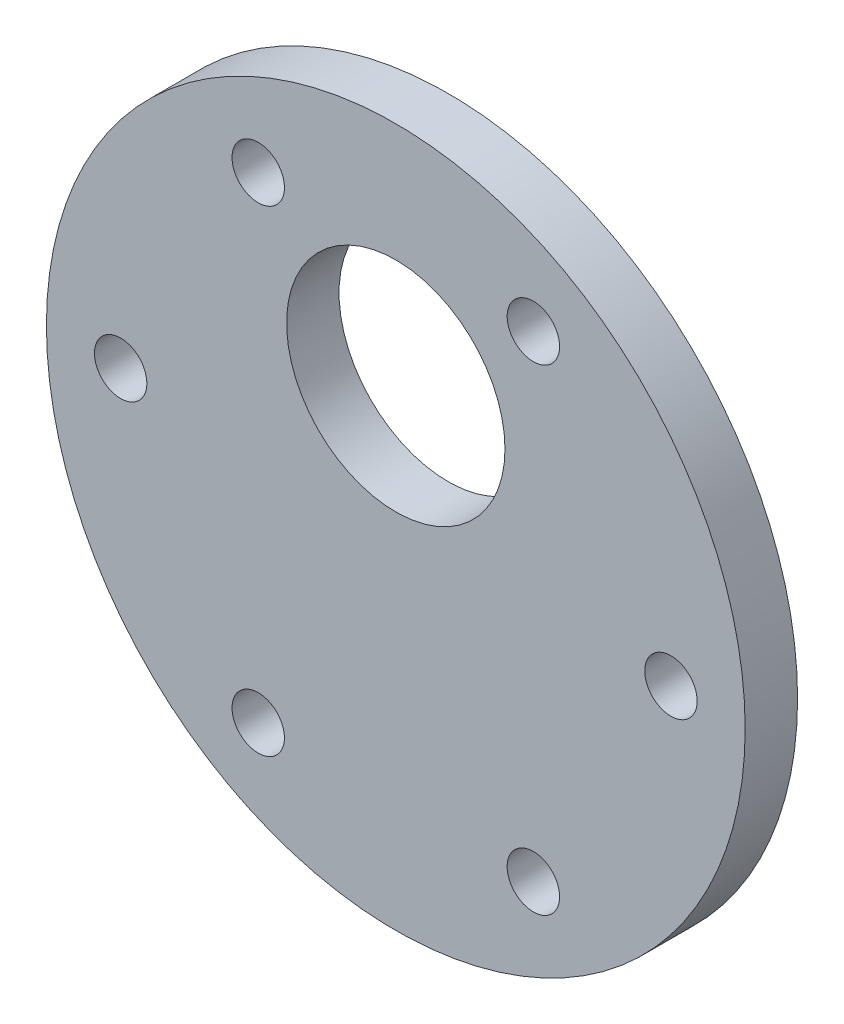
ISO-10303-21;
HEADER;
FILE_DESCRIPTION(('STEP AP214'),'2;1');
FILE_NAME('part.step','',(''),(''),'','','');
FILE_SCHEMA(('AUTOMOTIVE_DESIGN { 1 0 10303 214 1 1 1 1 }'));
ENDSEC;
DATA;
#1=APPLICATION_CONTEXT('core data for automotive mechanical design processes');
#2=APPLICATION_PROTOCOL_DEFINITION('international standard','automotive_design',2000,#1);
#3=PRODUCT_CONTEXT('',#1,'mechanical');
#4=PRODUCT('Part','Part','',(#3));
#5=PRODUCT_RELATED_PRODUCT_CATEGORY('part','',(#4));
#6=PRODUCT_DEFINITION_FORMATION('','',#4);
#7=PRODUCT_DEFINITION_CONTEXT('part definition',#1,'design');
#8=PRODUCT_DEFINITION('design','',#6,#7);
#9=PRODUCT_DEFINITION_SHAPE('','',#8);
#10=(LENGTH_UNIT() NAMED_UNIT(*) SI_UNIT(.MILLI.,.METRE.));
#11=(NAMED_UNIT(*) PLANE_ANGLE_UNIT() SI_UNIT($,.RADIAN.));
#12=(NAMED_UNIT(*) SI_UNIT($,.STERADIAN.) SOLID_ANGLE_UNIT());
#13=UNCERTAINTY_MEASURE_WITH_UNIT(LENGTH_MEASURE(1.E-05),#10,'distance_accuracy_value','');
#14=(GEOMETRIC_REPRESENTATION_CONTEXT(3) GLOBAL_UNCERTAINTY_ASSIGNED_CONTEXT((#13)) GLOBAL_UNIT_ASSIGNED_CONTEXT((#10,
#11,#12)) REPRESENTATION_CONTEXT('',''));
#15=CARTESIAN_POINT('',(0.,0.,0.));
#16=DIRECTION('',(0.,0.,1.));
#17=DIRECTION('',(1.,0.,0.));
#18=AXIS2_PLACEMENT_3D('',#15,#16,#17);
#19=CARTESIAN_POINT('',(0.,0.,3.));
#20=DIRECTION('',(0.,0.,-1.));
#21=DIRECTION('',(-1.,0.,0.));
#22=AXIS2_PLACEMENT_3D('',#19,#20,#21);
#23=CYLINDRICAL_SURFACE('',#22,20.);
#24=CARTESIAN_POINT('',(0.,0.,3.));
#25=DIRECTION('',(0.,0.,1.));
#26=DIRECTION('',(1.,0.,0.));
#27=AXIS2_PLACEMENT_3D('',#24,#25,#26);
#28=CIRCLE('',#27,20.);
#29=CARTESIAN_POINT('',(20.,0.,3.));
#30=VERTEX_POINT('',#29);
#31=EDGE_CURVE('E10',#30,#30,#28,.T.);
#32=ORIENTED_EDGE('',*,*,#31,.F.);
#33=EDGE_LOOP('',(#32));
#34=FACE_BOUND('',#33,.T.);
#35=CARTESIAN_POINT('',(0.,0.,0.));
#36=DIRECTION('',(0.,0.,1.));
#37=DIRECTION('',(1.,0.,0.));
#38=AXIS2_PLACEMENT_3D('',#35,#36,#37);
#39=CIRCLE('',#38,20.);
#40=CARTESIAN_POINT('',(20.,0.,0.));
#41=VERTEX_POINT('',#40);
#42=EDGE_CURVE('E40',#41,#41,#39,.T.);
#43=ORIENTED_EDGE('',*,*,#42,.T.);
#44=EDGE_LOOP('',(#43));
#45=FACE_BOUND('',#44,.T.);
#46=ADVANCED_FACE('F33',(#34,#45),#23,.T.);
#47=CARTESIAN_POINT('',(0.,0.,3.));
#48=DIRECTION('',(0.,0.,1.));
#49=DIRECTION('',(1.,0.,0.));
#50=AXIS2_PLACEMENT_3D('',#47,#48,#49);
#51=PLANE('',#50);
#52=CARTESIAN_POINT('',(-7.87499999999999,-13.6399001096049,3.));
#53=DIRECTION('',(0.,0.,1.));
#54=DIRECTION('',(1.,0.,0.));
#55=AXIS2_PLACEMENT_3D('',#52,#53,#54);
#56=CIRCLE('',#55,1.5);
#57=CARTESIAN_POINT('',(-6.37499999999999,-13.6399001096049,3.));
#58=VERTEX_POINT('',#57);
#59=EDGE_CURVE('E146',#58,#58,#56,.T.);
#60=ORIENTED_EDGE('',*,*,#59,.F.);
#61=EDGE_LOOP('',(#60));
#62=FACE_BOUND('',#61,.T.);
#63=CARTESIAN_POINT('',(7.87500000000001,-13.6399001096049,3.));
#64=DIRECTION('',(0.,0.,1.));
#65=DIRECTION('',(1.,0.,0.));
#66=AXIS2_PLACEMENT_3D('',#63,#64,#65);
#67=CIRCLE('',#66,1.5);
#68=CARTESIAN_POINT('',(9.37500000000001,-13.6399001096049,3.));
#69=VERTEX_POINT('',#68);
#70=EDGE_CURVE('E140',#69,#69,#67,.T.);
#71=ORIENTED_EDGE('',*,*,#70,.F.);
#72=EDGE_LOOP('',(#71));
#73=FACE_BOUND('',#72,.T.);
#74=CARTESIAN_POINT('',(15.75,0.,3.));
#75=DIRECTION('',(0.,0.,1.));
#76=DIRECTION('',(1.,0.,0.));
#77=AXIS2_PLACEMENT_3D('',#74,#75,#76);
#78=CIRCLE('',#77,1.5);
#79=CARTESIAN_POINT('',(17.25,0.,3.));
#80=VERTEX_POINT('',#79);
#81=EDGE_CURVE('E121',#80,#80,#78,.T.);
#82=ORIENTED_EDGE('',*,*,#81,.F.);
#83=EDGE_LOOP('',(#82));
#84=FACE_BOUND('',#83,.T.);
#85=CARTESIAN_POINT('',(0.,7.,3.));
#86=DIRECTION('',(0.,0.,1.));
#87=DIRECTION('',(1.,0.,0.));
#88=AXIS2_PLACEMENT_3D('',#85,#86,#87);
#89=CIRCLE('',#88,6.25);
#90=CARTESIAN_POINT('',(6.25,7.,3.));
#91=VERTEX_POINT('',#90);
#92=EDGE_CURVE('E57',#91,#91,#89,.T.);
#93=ORIENTED_EDGE('',*,*,#92,.F.);
#94=EDGE_LOOP('',(#93));
#95=FACE_BOUND('',#94,.T.);
#96=CARTESIAN_POINT('',(-7.87500000000001,13.6399001096049,3.));
#97=DIRECTION('',(0.,0.,1.));
#98=DIRECTION('',(1.,0.,0.));
#99=AXIS2_PLACEMENT_3D('',#96,#97,#98);
#100=CIRCLE('',#99,1.5);
#101=CARTESIAN_POINT('',(-6.375,13.6399001096049,3.));
#102=VERTEX_POINT('',#101);
#103=EDGE_CURVE('E143',#102,#102,#100,.T.);
#104=ORIENTED_EDGE('',*,*,#103,.F.);
#105=EDGE_LOOP('',(#104));
#106=FACE_BOUND('',#105,.T.);
#107=CARTESIAN_POINT('',(7.875,13.6399001096049,3.));
#108=DIRECTION('',(0.,0.,1.));
#109=DIRECTION('',(1.,0.,0.));
#110=AXIS2_PLACEMENT_3D('',#107,#108,#109);
#111=CIRCLE('',#110,1.5);
#112=CARTESIAN_POINT('',(9.375,13.6399001096049,3.));
#113=VERTEX_POINT('',#112);
#114=EDGE_CURVE('E139',#113,#113,#111,.T.);
#115=ORIENTED_EDGE('',*,*,#114,.F.);
#116=EDGE_LOOP('',(#115));
#117=FACE_BOUND('',#116,.T.);
#118=CARTESIAN_POINT('',(-15.75,0.,3.));
#119=DIRECTION('',(0.,0.,1.));
#120=DIRECTION('',(1.,0.,0.));
#121=AXIS2_PLACEMENT_3D('',#118,#119,#120);
#122=CIRCLE('',#121,1.5);
#123=CARTESIAN_POINT('',(-14.25,0.,3.));
#124=VERTEX_POINT('',#123);
#125=EDGE_CURVE('E48',#124,#124,#122,.T.);
#126=ORIENTED_EDGE('',*,*,#125,.F.);
#127=EDGE_LOOP('',(#126));
#128=FACE_BOUND('',#127,.T.);
#129=ORIENTED_EDGE('',*,*,#31,.T.);
#130=EDGE_LOOP('',(#129));
#131=FACE_BOUND('',#130,.T.);
#132=ADVANCED_FACE('F78',(#62,#73,#84,#95,#106,#117,#128,#131),#51,.T.);
#133=CARTESIAN_POINT('',(0.,0.,0.));
#134=DIRECTION('',(0.,0.,1.));
#135=DIRECTION('',(1.,0.,0.));
#136=AXIS2_PLACEMENT_3D('',#133,#134,#135);
#137=PLANE('',#136);
#138=CARTESIAN_POINT('',(-7.87499999999999,-13.6399001096049,0.));
#139=DIRECTION('',(0.,0.,1.));
#140=DIRECTION('',(1.,0.,0.));
#141=AXIS2_PLACEMENT_3D('',#138,#139,#140);
#142=CIRCLE('',#141,1.5);
#143=CARTESIAN_POINT('',(-6.37499999999999,-13.6399001096049,0.));
#144=VERTEX_POINT('',#143);
#145=EDGE_CURVE('E36',#144,#144,#142,.T.);
#146=ORIENTED_EDGE('',*,*,#145,.T.);
#147=EDGE_LOOP('',(#146));
#148=FACE_BOUND('',#147,.T.);
#149=CARTESIAN_POINT('',(7.87500000000001,-13.6399001096049,0.));
#150=DIRECTION('',(0.,0.,1.));
#151=DIRECTION('',(1.,0.,0.));
#152=AXIS2_PLACEMENT_3D('',#149,#150,#151);
#153=CIRCLE('',#152,1.5);
#154=CARTESIAN_POINT('',(9.37500000000001,-13.6399001096049,0.));
#155=VERTEX_POINT('',#154);
#156=EDGE_CURVE('E65',#155,#155,#153,.T.);
#157=ORIENTED_EDGE('',*,*,#156,.T.);
#158=EDGE_LOOP('',(#157));
#159=FACE_BOUND('',#158,.T.);
#160=CARTESIAN_POINT('',(15.75,0.,0.));
#161=DIRECTION('',(0.,0.,1.));
#162=DIRECTION('',(1.,0.,0.));
#163=AXIS2_PLACEMENT_3D('',#160,#161,#162);
#164=CIRCLE('',#163,1.5);
#165=CARTESIAN_POINT('',(17.25,0.,0.));
#166=VERTEX_POINT('',#165);
#167=EDGE_CURVE('E63',#166,#166,#164,.T.);
#168=ORIENTED_EDGE('',*,*,#167,.T.);
#169=EDGE_LOOP('',(#168));
#170=FACE_BOUND('',#169,.T.);
#171=CARTESIAN_POINT('',(0.,7.,0.));
#172=DIRECTION('',(0.,0.,1.));
#173=DIRECTION('',(1.,0.,0.));
#174=AXIS2_PLACEMENT_3D('',#171,#172,#173);
#175=CIRCLE('',#174,6.25);
#176=CARTESIAN_POINT('',(6.25,7.,0.));
#177=VERTEX_POINT('',#176);
#178=EDGE_CURVE('E60',#177,#177,#175,.T.);
#179=ORIENTED_EDGE('',*,*,#178,.T.);
#180=EDGE_LOOP('',(#179));
#181=FACE_BOUND('',#180,.T.);
#182=CARTESIAN_POINT('',(-7.87500000000001,13.6399001096049,0.));
#183=DIRECTION('',(0.,0.,1.));
#184=DIRECTION('',(1.,0.,0.));
#185=AXIS2_PLACEMENT_3D('',#182,#183,#184);
#186=CIRCLE('',#185,1.5);
#187=CARTESIAN_POINT('',(-6.375,13.6399001096049,0.));
#188=VERTEX_POINT('',#187);
#189=EDGE_CURVE('E56',#188,#188,#186,.T.);
#190=ORIENTED_EDGE('',*,*,#189,.T.);
#191=EDGE_LOOP('',(#190));
#192=FACE_BOUND('',#191,.T.);
#193=CARTESIAN_POINT('',(7.875,13.6399001096049,0.));
#194=DIRECTION('',(0.,0.,1.));
#195=DIRECTION('',(1.,0.,0.));
#196=AXIS2_PLACEMENT_3D('',#193,#194,#195);
#197=CIRCLE('',#196,1.5);
#198=CARTESIAN_POINT('',(9.375,13.6399001096049,0.));
#199=VERTEX_POINT('',#198);
#200=EDGE_CURVE('E53',#199,#199,#197,.T.);
#201=ORIENTED_EDGE('',*,*,#200,.T.);
#202=EDGE_LOOP('',(#201));
#203=FACE_BOUND('',#202,.T.);
#204=CARTESIAN_POINT('',(-15.75,0.,0.));
#205=DIRECTION('',(0.,0.,1.));
#206=DIRECTION('',(1.,0.,0.));
#207=AXIS2_PLACEMENT_3D('',#204,#205,#206);
#208=CIRCLE('',#207,1.5);
#209=CARTESIAN_POINT('',(-14.25,0.,0.));
#210=VERTEX_POINT('',#209);
#211=EDGE_CURVE('E45',#210,#210,#208,.T.);
#212=ORIENTED_EDGE('',*,*,#211,.T.);
#213=EDGE_LOOP('',(#212));
#214=FACE_BOUND('',#213,.T.);
#215=ORIENTED_EDGE('',*,*,#42,.F.);
#216=EDGE_LOOP('',(#215));
#217=FACE_BOUND('',#216,.T.);
#218=ADVANCED_FACE('F80',(#148,#159,#170,#181,#192,#203,#214,#217),#137,.F.);
#219=CARTESIAN_POINT('',(-15.75,0.,-1.2E-05));
#220=DIRECTION('',(0.,0.,1.));
#221=DIRECTION('',(1.,0.,0.));
#222=AXIS2_PLACEMENT_3D('',#219,#220,#221);
#223=CYLINDRICAL_SURFACE('',#222,1.5);
#224=CARTESIAN_POINT('',(-14.25,0.,3.));
#225=CARTESIAN_POINT('',(-14.25,0.,2.96875));
#226=CARTESIAN_POINT('',(-14.25,0.,2.9375));
#227=CARTESIAN_POINT('',(-14.25,0.,2.875));
#228=CARTESIAN_POINT('',(-14.25,0.,2.84375));
#229=CARTESIAN_POINT('',(-14.25,0.,2.78125));
#230=CARTESIAN_POINT('',(-14.25,0.,2.75));
#231=CARTESIAN_POINT('',(-14.25,0.,2.6875));
#232=CARTESIAN_POINT('',(-14.25,0.,2.65625));
#233=CARTESIAN_POINT('',(-14.25,0.,2.59375));
#234=CARTESIAN_POINT('',(-14.25,0.,2.5625));
#235=CARTESIAN_POINT('',(-14.25,0.,2.5));
#236=CARTESIAN_POINT('',(-14.25,0.,2.46875));
#237=CARTESIAN_POINT('',(-14.25,0.,2.40625));
#238=CARTESIAN_POINT('',(-14.25,0.,2.375));
#239=CARTESIAN_POINT('',(-14.25,0.,2.3125));
#240=CARTESIAN_POINT('',(-14.25,0.,2.28125));
#241=CARTESIAN_POINT('',(-14.25,0.,2.21875));
#242=CARTESIAN_POINT('',(-14.25,0.,2.1875));
#243=CARTESIAN_POINT('',(-14.25,0.,2.125));
#244=CARTESIAN_POINT('',(-14.25,0.,2.09375));
#245=CARTESIAN_POINT('',(-14.25,0.,2.03125));
#246=CARTESIAN_POINT('',(-14.25,0.,2.));
#247=CARTESIAN_POINT('',(-14.25,0.,1.9375));
#248=CARTESIAN_POINT('',(-14.25,0.,1.90625));
#249=CARTESIAN_POINT('',(-14.25,0.,1.84375));
#250=CARTESIAN_POINT('',(-14.25,0.,1.8125));
#251=CARTESIAN_POINT('',(-14.25,0.,1.75));
#252=CARTESIAN_POINT('',(-14.25,0.,1.71875));
#253=CARTESIAN_POINT('',(-14.25,0.,1.65625));
#254=CARTESIAN_POINT('',(-14.25,0.,1.625));
#255=CARTESIAN_POINT('',(-14.25,0.,1.5625));
#256=CARTESIAN_POINT('',(-14.25,0.,1.53125));
#257=CARTESIAN_POINT('',(-14.25,0.,1.46875));
#258=CARTESIAN_POINT('',(-14.25,0.,1.4375));
#259=CARTESIAN_POINT('',(-14.25,0.,1.375));
#260=CARTESIAN_POINT('',(-14.25,0.,1.34375));
#261=CARTESIAN_POINT('',(-14.25,0.,1.28125));
#262=CARTESIAN_POINT('',(-14.25,0.,1.25));
#263=CARTESIAN_POINT('',(-14.25,0.,1.1875));
#264=CARTESIAN_POINT('',(-14.25,0.,1.15625));
#265=CARTESIAN_POINT('',(-14.25,0.,1.09375));
#266=CARTESIAN_POINT('',(-14.25,0.,1.0625));
#267=CARTESIAN_POINT('',(-14.25,0.,1.));
#268=CARTESIAN_POINT('',(-14.25,0.,0.96875));
#269=CARTESIAN_POINT('',(-14.25,0.,0.90625));
#270=CARTESIAN_POINT('',(-14.25,0.,0.875));
#271=CARTESIAN_POINT('',(-14.25,0.,0.8125));
#272=CARTESIAN_POINT('',(-14.25,0.,0.78125));
#273=CARTESIAN_POINT('',(-14.25,0.,0.71875));
#274=CARTESIAN_POINT('',(-14.25,0.,0.6875));
#275=CARTESIAN_POINT('',(-14.25,0.,0.625));
#276=CARTESIAN_POINT('',(-14.25,0.,0.59375));
#277=CARTESIAN_POINT('',(-14.25,0.,0.53125));
#278=CARTESIAN_POINT('',(-14.25,0.,0.5));
#279=CARTESIAN_POINT('',(-14.25,0.,0.4375));
#280=CARTESIAN_POINT('',(-14.25,0.,0.40625));
#281=CARTESIAN_POINT('',(-14.25,0.,0.34375));
#282=CARTESIAN_POINT('',(-14.25,0.,0.3125));
#283=CARTESIAN_POINT('',(-14.25,0.,0.25));
#284=CARTESIAN_POINT('',(-14.25,0.,0.21875));
#285=CARTESIAN_POINT('',(-14.25,0.,0.15625));
#286=CARTESIAN_POINT('',(-14.25,0.,0.125));
#287=CARTESIAN_POINT('',(-14.25,0.,0.0625000000000002));
#288=CARTESIAN_POINT('',(-14.25,0.,0.0312500000000002));
#289=CARTESIAN_POINT('',(-14.25,0.,0.));
#290=B_SPLINE_CURVE_WITH_KNOTS('',3,(#224,#225,#226,#227,#228,#229,#230,#231,#232,#233,#234,
#235,#236,#237,#238,#239,#240,#241,#242,#243,#244,#245,#246,#247,#248,#249,#250,#251,#252,#253,
#254,#255,#256,#257,#258,#259,#260,#261,#262,#263,#264,#265,#266,#267,#268,#269,#270,#271,#272,
#273,#274,#275,#276,#277,#278,#279,#280,#281,#282,#283,#284,#285,#286,#287,#288,#289),
.UNSPECIFIED.,.F.,.F.,(4,2,2,2,2,2,2,2,2,2,2,2,2,2,2,2,2,2,2,2,2,2,2,2,2,2,2,2,2,2,2,2,4),(0.,
0.0937500000000001,0.1875,0.28125,0.375,0.46875,0.5625,0.65625,0.75,0.84375,0.9375,1.03125,
1.125,1.21875,1.3125,1.40625,1.5,1.59375,1.6875,1.78125,1.875,1.96875,2.0625,2.15625,2.25,
2.34375,2.4375,2.53125,2.625,2.71875,2.8125,2.90625,3.),.UNSPECIFIED.);
#291=EDGE_CURVE('BSEAM75',#124,#210,#290,.T.);
#292=ORIENTED_EDGE('',*,*,#125,.T.);
#293=ORIENTED_EDGE('',*,*,#211,.F.);
#294=ORIENTED_EDGE('',*,*,#291,.T.);
#295=ORIENTED_EDGE('',*,*,#291,.F.);
#296=EDGE_LOOP('',(#292,#294,#293,#295));
#297=FACE_BOUND('',#296,.T.);
#298=ADVANCED_FACE('F75',(#297),#223,.F.);
#299=CARTESIAN_POINT('',(7.875,13.6399001096049,-1.2E-05));
#300=DIRECTION('',(0.,0.,1.));
#301=DIRECTION('',(1.,0.,0.));
#302=AXIS2_PLACEMENT_3D('',#299,#300,#301);
#303=CYLINDRICAL_SURFACE('',#302,1.5);
#304=CARTESIAN_POINT('',(9.375,13.6399001096049,3.));
#305=CARTESIAN_POINT('',(9.375,13.6399001096049,2.96875));
#306=CARTESIAN_POINT('',(9.375,13.6399001096049,2.9375));
#307=CARTESIAN_POINT('',(9.375,13.6399001096049,2.875));
#308=CARTESIAN_POINT('',(9.375,13.6399001096049,2.84375));
#309=CARTESIAN_POINT('',(9.375,13.6399001096049,2.78125));
#310=CARTESIAN_POINT('',(9.375,13.6399001096049,2.75));
#311=CARTESIAN_POINT('',(9.375,13.6399001096049,2.6875));
#312=CARTESIAN_POINT('',(9.375,13.6399001096049,2.65625));
#313=CARTESIAN_POINT('',(9.375,13.6399001096049,2.59375));
#314=CARTESIAN_POINT('',(9.375,13.6399001096049,2.5625));
#315=CARTESIAN_POINT('',(9.375,13.6399001096049,2.5));
#316=CARTESIAN_POINT('',(9.375,13.6399001096049,2.46875));
#317=CARTESIAN_POINT('',(9.375,13.6399001096049,2.40625));
#318=CARTESIAN_POINT('',(9.375,13.6399001096049,2.375));
#319=CARTESIAN_POINT('',(9.375,13.6399001096049,2.3125));
#320=CARTESIAN_POINT('',(9.375,13.6399001096049,2.28125));
#321=CARTESIAN_POINT('',(9.375,13.6399001096049,2.21875));
#322=CARTESIAN_POINT('',(9.375,13.6399001096049,2.1875));
#323=CARTESIAN_POINT('',(9.375,13.6399001096049,2.125));
#324=CARTESIAN_POINT('',(9.375,13.6399001096049,2.09375));
#325=CARTESIAN_POINT('',(9.375,13.6399001096049,2.03125));
#326=CARTESIAN_POINT('',(9.375,13.6399001096049,2.));
#327=CARTESIAN_POINT('',(9.375,13.6399001096049,1.9375));
#328=CARTESIAN_POINT('',(9.375,13.6399001096049,1.90625));
#329=CARTESIAN_POINT('',(9.375,13.6399001096049,1.84375));
#330=CARTESIAN_POINT('',(9.375,13.6399001096049,1.8125));
#331=CARTESIAN_POINT('',(9.375,13.6399001096049,1.75));
#332=CARTESIAN_POINT('',(9.375,13.6399001096049,1.71875));
#333=CARTESIAN_POINT('',(9.375,13.6399001096049,1.65625));
#334=CARTESIAN_POINT('',(9.375,13.6399001096049,1.625));
#335=CARTESIAN_POINT('',(9.375,13.6399001096049,1.5625));
#336=CARTESIAN_POINT('',(9.375,13.6399001096049,1.53125));
#337=CARTESIAN_POINT('',(9.375,13.6399001096049,1.46875));
#338=CARTESIAN_POINT('',(9.375,13.6399001096049,1.4375));
#339=CARTESIAN_POINT('',(9.375,13.6399001096049,1.375));
#340=CARTESIAN_POINT('',(9.375,13.6399001096049,1.34375));
#341=CARTESIAN_POINT('',(9.375,13.6399001096049,1.28125));
#342=CARTESIAN_POINT('',(9.375,13.6399001096049,1.25));
#343=CARTESIAN_POINT('',(9.375,13.6399001096049,1.1875));
#344=CARTESIAN_POINT('',(9.375,13.6399001096049,1.15625));
#345=CARTESIAN_POINT('',(9.375,13.6399001096049,1.09375));
#346=CARTESIAN_POINT('',(9.375,13.6399001096049,1.0625));
#347=CARTESIAN_POINT('',(9.375,13.6399001096049,1.));
#348=CARTESIAN_POINT('',(9.375,13.6399001096049,0.96875));
#349=CARTESIAN_POINT('',(9.375,13.6399001096049,0.90625));
#350=CARTESIAN_POINT('',(9.375,13.6399001096049,0.875));
#351=CARTESIAN_POINT('',(9.375,13.6399001096049,0.8125));
#352=CARTESIAN_POINT('',(9.375,13.6399001096049,0.78125));
#353=CARTESIAN_POINT('',(9.375,13.6399001096049,0.71875));
#354=CARTESIAN_POINT('',(9.375,13.6399001096049,0.6875));
#355=CARTESIAN_POINT('',(9.375,13.6399001096049,0.625));
#356=CARTESIAN_POINT('',(9.375,13.6399001096049,0.59375));
#357=CARTESIAN_POINT('',(9.375,13.6399001096049,0.53125));
#358=CARTESIAN_POINT('',(9.375,13.6399001096049,0.5));
#359=CARTESIAN_POINT('',(9.375,13.6399001096049,0.4375));
#360=CARTESIAN_POINT('',(9.375,13.6399001096049,0.40625));
#361=CARTESIAN_POINT('',(9.375,13.6399001096049,0.34375));
#362=CARTESIAN_POINT('',(9.375,13.6399001096049,0.3125));
#363=CARTESIAN_POINT('',(9.375,13.6399001096049,0.25));
#364=CARTESIAN_POINT('',(9.375,13.6399001096049,0.21875));
#365=CARTESIAN_POINT('',(9.375,13.6399001096049,0.15625));
#366=CARTESIAN_POINT('',(9.375,13.6399001096049,0.125));
#367=CARTESIAN_POINT('',(9.375,13.6399001096049,0.0625000000000002));
#368=CARTESIAN_POINT('',(9.375,13.6399001096049,0.0312500000000002));
#369=CARTESIAN_POINT('',(9.375,13.6399001096049,0.));
#370=B_SPLINE_CURVE_WITH_KNOTS('',3,(#304,#305,#306,#307,#308,#309,#310,#311,#312,#313,#314,
#315,#316,#317,#318,#319,#320,#321,#322,#323,#324,#325,#326,#327,#328,#329,#330,#331,#332,#333,
#334,#335,#336,#337,#338,#339,#340,#341,#342,#343,#344,#345,#346,#347,#348,#349,#350,#351,#352,
#353,#354,#355,#356,#357,#358,#359,#360,#361,#362,#363,#364,#365,#366,#367,#368,#369),
.UNSPECIFIED.,.F.,.F.,(4,2,2,2,2,2,2,2,2,2,2,2,2,2,2,2,2,2,2,2,2,2,2,2,2,2,2,2,2,2,2,2,4),(0.,
0.0937500000000001,0.1875,0.28125,0.375,0.46875,0.5625,0.65625,0.75,0.84375,0.9375,1.03125,
1.125,1.21875,1.3125,1.40625,1.5,1.59375,1.6875,1.78125,1.875,1.96875,2.0625,2.15625,2.25,
2.34375,2.4375,2.53125,2.625,2.71875,2.8125,2.90625,3.),.UNSPECIFIED.);
#371=EDGE_CURVE('BSEAM93',#113,#199,#370,.T.);
#372=ORIENTED_EDGE('',*,*,#114,.T.);
#373=ORIENTED_EDGE('',*,*,#200,.F.);
#374=ORIENTED_EDGE('',*,*,#371,.T.);
#375=ORIENTED_EDGE('',*,*,#371,.F.);
#376=EDGE_LOOP('',(#372,#374,#373,#375));
#377=FACE_BOUND('',#376,.T.);
#378=ADVANCED_FACE('F93',(#377),#303,.F.);
#379=CARTESIAN_POINT('',(-7.87500000000001,13.6399001096049,-1.2E-05));
#380=DIRECTION('',(0.,0.,1.));
#381=DIRECTION('',(1.,0.,0.));
#382=AXIS2_PLACEMENT_3D('',#379,#380,#381);
#383=CYLINDRICAL_SURFACE('',#382,1.5);
#384=CARTESIAN_POINT('',(-6.375,13.6399001096049,3.));
#385=CARTESIAN_POINT('',(-6.375,13.6399001096049,2.96875));
#386=CARTESIAN_POINT('',(-6.375,13.6399001096049,2.9375));
#387=CARTESIAN_POINT('',(-6.375,13.6399001096049,2.875));
#388=CARTESIAN_POINT('',(-6.375,13.6399001096049,2.84375));
#389=CARTESIAN_POINT('',(-6.375,13.6399001096049,2.78125));
#390=CARTESIAN_POINT('',(-6.375,13.6399001096049,2.75));
#391=CARTESIAN_POINT('',(-6.375,13.6399001096049,2.6875));
#392=CARTESIAN_POINT('',(-6.375,13.6399001096049,2.65625));
#393=CARTESIAN_POINT('',(-6.375,13.6399001096049,2.59375));
#394=CARTESIAN_POINT('',(-6.375,13.6399001096049,2.5625));
#395=CARTESIAN_POINT('',(-6.375,13.6399001096049,2.5));
#396=CARTESIAN_POINT('',(-6.375,13.6399001096049,2.46875));
#397=CARTESIAN_POINT('',(-6.375,13.6399001096049,2.40625));
#398=CARTESIAN_POINT('',(-6.375,13.6399001096049,2.375));
#399=CARTESIAN_POINT('',(-6.375,13.6399001096049,2.3125));
#400=CARTESIAN_POINT('',(-6.375,13.6399001096049,2.28125));
#401=CARTESIAN_POINT('',(-6.375,13.6399001096049,2.21875));
#402=CARTESIAN_POINT('',(-6.375,13.6399001096049,2.1875));
#403=CARTESIAN_POINT('',(-6.375,13.6399001096049,2.125));
#404=CARTESIAN_POINT('',(-6.375,13.6399001096049,2.09375));
#405=CARTESIAN_POINT('',(-6.375,13.6399001096049,2.03125));
#406=CARTESIAN_POINT('',(-6.375,13.6399001096049,2.));
#407=CARTESIAN_POINT('',(-6.375,13.6399001096049,1.9375));
#408=CARTESIAN_POINT('',(-6.375,13.6399001096049,1.90625));
#409=CARTESIAN_POINT('',(-6.375,13.6399001096049,1.84375));
#410=CARTESIAN_POINT('',(-6.375,13.6399001096049,1.8125));
#411=CARTESIAN_POINT('',(-6.375,13.6399001096049,1.75));
#412=CARTESIAN_POINT('',(-6.375,13.6399001096049,1.71875));
#413=CARTESIAN_POINT('',(-6.375,13.6399001096049,1.65625));
#414=CARTESIAN_POINT('',(-6.375,13.6399001096049,1.625));
#415=CARTESIAN_POINT('',(-6.375,13.6399001096049,1.5625));
#416=CARTESIAN_POINT('',(-6.375,13.6399001096049,1.53125));
#417=CARTESIAN_POINT('',(-6.375,13.6399001096049,1.46875));
#418=CARTESIAN_POINT('',(-6.375,13.6399001096049,1.4375));
#419=CARTESIAN_POINT('',(-6.375,13.6399001096049,1.375));
#420=CARTESIAN_POINT('',(-6.375,13.6399001096049,1.34375));
#421=CARTESIAN_POINT('',(-6.375,13.6399001096049,1.28125));
#422=CARTESIAN_POINT('',(-6.375,13.6399001096049,1.25));
#423=CARTESIAN_POINT('',(-6.375,13.6399001096049,1.1875));
#424=CARTESIAN_POINT('',(-6.375,13.6399001096049,1.15625));
#425=CARTESIAN_POINT('',(-6.375,13.6399001096049,1.09375));
#426=CARTESIAN_POINT('',(-6.375,13.6399001096049,1.0625));
#427=CARTESIAN_POINT('',(-6.375,13.6399001096049,1.));
#428=CARTESIAN_POINT('',(-6.375,13.6399001096049,0.96875));
#429=CARTESIAN_POINT('',(-6.375,13.6399001096049,0.90625));
#430=CARTESIAN_POINT('',(-6.375,13.6399001096049,0.875));
#431=CARTESIAN_POINT('',(-6.375,13.6399001096049,0.8125));
#432=CARTESIAN_POINT('',(-6.375,13.6399001096049,0.78125));
#433=CARTESIAN_POINT('',(-6.375,13.6399001096049,0.71875));
#434=CARTESIAN_POINT('',(-6.375,13.6399001096049,0.6875));
#435=CARTESIAN_POINT('',(-6.375,13.6399001096049,0.625));
#436=CARTESIAN_POINT('',(-6.375,13.6399001096049,0.59375));
#437=CARTESIAN_POINT('',(-6.375,13.6399001096049,0.53125));
#438=CARTESIAN_POINT('',(-6.375,13.6399001096049,0.5));
#439=CARTESIAN_POINT('',(-6.375,13.6399001096049,0.4375));
#440=CARTESIAN_POINT('',(-6.375,13.6399001096049,0.40625));
#441=CARTESIAN_POINT('',(-6.375,13.6399001096049,0.34375));
#442=CARTESIAN_POINT('',(-6.375,13.6399001096049,0.3125));
#443=CARTESIAN_POINT('',(-6.375,13.6399001096049,0.25));
#444=CARTESIAN_POINT('',(-6.375,13.6399001096049,0.21875));
#445=CARTESIAN_POINT('',(-6.375,13.6399001096049,0.15625));
#446=CARTESIAN_POINT('',(-6.375,13.6399001096049,0.125));
#447=CARTESIAN_POINT('',(-6.375,13.6399001096049,0.0625000000000002));
#448=CARTESIAN_POINT('',(-6.375,13.6399001096049,0.0312500000000002));
#449=CARTESIAN_POINT('',(-6.375,13.6399001096049,0.));
#450=B_SPLINE_CURVE_WITH_KNOTS('',3,(#384,#385,#386,#387,#388,#389,#390,#391,#392,#393,#394,
#395,#396,#397,#398,#399,#400,#401,#402,#403,#404,#405,#406,#407,#408,#409,#410,#411,#412,#413,
#414,#415,#416,#417,#418,#419,#420,#421,#422,#423,#424,#425,#426,#427,#428,#429,#430,#431,#432,
#433,#434,#435,#436,#437,#438,#439,#440,#441,#442,#443,#444,#445,#446,#447,#448,#449),
.UNSPECIFIED.,.F.,.F.,(4,2,2,2,2,2,2,2,2,2,2,2,2,2,2,2,2,2,2,2,2,2,2,2,2,2,2,2,2,2,2,2,4),(0.,
0.0937500000000001,0.1875,0.28125,0.375,0.46875,0.5625,0.65625,0.75,0.84375,0.9375,1.03125,
1.125,1.21875,1.3125,1.40625,1.5,1.59375,1.6875,1.78125,1.875,1.96875,2.0625,2.15625,2.25,
2.34375,2.4375,2.53125,2.625,2.71875,2.8125,2.90625,3.),.UNSPECIFIED.);
#451=EDGE_CURVE('BSEAM98',#102,#188,#450,.T.);
#452=ORIENTED_EDGE('',*,*,#103,.T.);
#453=ORIENTED_EDGE('',*,*,#189,.F.);
#454=ORIENTED_EDGE('',*,*,#451,.T.);
#455=ORIENTED_EDGE('',*,*,#451,.F.);
#456=EDGE_LOOP('',(#452,#454,#453,#455));
#457=FACE_BOUND('',#456,.T.);
#458=ADVANCED_FACE('F98',(#457),#383,.F.);
#459=CARTESIAN_POINT('',(0.,7.,-1.2E-05));
#460=DIRECTION('',(0.,0.,1.));
#461=DIRECTION('',(1.,0.,0.));
#462=AXIS2_PLACEMENT_3D('',#459,#460,#461);
#463=CYLINDRICAL_SURFACE('',#462,6.25);
#464=CARTESIAN_POINT('',(6.25,7.,3.));
#465=CARTESIAN_POINT('',(6.25,7.,2.96875));
#466=CARTESIAN_POINT('',(6.25,7.,2.9375));
#467=CARTESIAN_POINT('',(6.25,7.,2.875));
#468=CARTESIAN_POINT('',(6.25,7.,2.84375));
#469=CARTESIAN_POINT('',(6.25,7.,2.78125));
#470=CARTESIAN_POINT('',(6.25,7.,2.75));
#471=CARTESIAN_POINT('',(6.25,7.,2.6875));
#472=CARTESIAN_POINT('',(6.25,7.,2.65625));
#473=CARTESIAN_POINT('',(6.25,7.,2.59375));
#474=CARTESIAN_POINT('',(6.25,7.,2.5625));
#475=CARTESIAN_POINT('',(6.25,7.,2.5));
#476=CARTESIAN_POINT('',(6.25,7.,2.46875));
#477=CARTESIAN_POINT('',(6.25,7.,2.40625));
#478=CARTESIAN_POINT('',(6.25,7.,2.375));
#479=CARTESIAN_POINT('',(6.25,7.,2.3125));
#480=CARTESIAN_POINT('',(6.25,7.,2.28125));
#481=CARTESIAN_POINT('',(6.25,7.,2.21875));
#482=CARTESIAN_POINT('',(6.25,7.,2.1875));
#483=CARTESIAN_POINT('',(6.25,7.,2.125));
#484=CARTESIAN_POINT('',(6.25,7.,2.09375));
#485=CARTESIAN_POINT('',(6.25,7.,2.03125));
#486=CARTESIAN_POINT('',(6.25,7.,2.));
#487=CARTESIAN_POINT('',(6.25,7.,1.9375));
#488=CARTESIAN_POINT('',(6.25,7.,1.90625));
#489=CARTESIAN_POINT('',(6.25,7.,1.84375));
#490=CARTESIAN_POINT('',(6.25,7.,1.8125));
#491=CARTESIAN_POINT('',(6.25,7.,1.75));
#492=CARTESIAN_POINT('',(6.25,7.,1.71875));
#493=CARTESIAN_POINT('',(6.25,7.,1.65625));
#494=CARTESIAN_POINT('',(6.25,7.,1.625));
#495=CARTESIAN_POINT('',(6.25,7.,1.5625));
#496=CARTESIAN_POINT('',(6.25,7.,1.53125));
#497=CARTESIAN_POINT('',(6.25,7.,1.46875));
#498=CARTESIAN_POINT('',(6.25,7.,1.4375));
#499=CARTESIAN_POINT('',(6.25,7.,1.375));
#500=CARTESIAN_POINT('',(6.25,7.,1.34375));
#501=CARTESIAN_POINT('',(6.25,7.,1.28125));
#502=CARTESIAN_POINT('',(6.25,7.,1.25));
#503=CARTESIAN_POINT('',(6.25,7.,1.1875));
#504=CARTESIAN_POINT('',(6.25,7.,1.15625));
#505=CARTESIAN_POINT('',(6.25,7.,1.09375));
#506=CARTESIAN_POINT('',(6.25,7.,1.0625));
#507=CARTESIAN_POINT('',(6.25,7.,1.));
#508=CARTESIAN_POINT('',(6.25,7.,0.96875));
#509=CARTESIAN_POINT('',(6.25,7.,0.90625));
#510=CARTESIAN_POINT('',(6.25,7.,0.875));
#511=CARTESIAN_POINT('',(6.25,7.,0.8125));
#512=CARTESIAN_POINT('',(6.25,7.,0.78125));
#513=CARTESIAN_POINT('',(6.25,7.,0.71875));
#514=CARTESIAN_POINT('',(6.25,7.,0.6875));
#515=CARTESIAN_POINT('',(6.25,7.,0.625));
#516=CARTESIAN_POINT('',(6.25,7.,0.59375));
#517=CARTESIAN_POINT('',(6.25,7.,0.53125));
#518=CARTESIAN_POINT('',(6.25,7.,0.5));
#519=CARTESIAN_POINT('',(6.25,7.,0.4375));
#520=CARTESIAN_POINT('',(6.25,7.,0.40625));
#521=CARTESIAN_POINT('',(6.25,7.,0.34375));
#522=CARTESIAN_POINT('',(6.25,7.,0.3125));
#523=CARTESIAN_POINT('',(6.25,7.,0.25));
#524=CARTESIAN_POINT('',(6.25,7.,0.21875));
#525=CARTESIAN_POINT('',(6.25,7.,0.15625));
#526=CARTESIAN_POINT('',(6.25,7.,0.125));
#527=CARTESIAN_POINT('',(6.25,7.,0.0625000000000002));
#528=CARTESIAN_POINT('',(6.25,7.,0.0312500000000002));
#529=CARTESIAN_POINT('',(6.25,7.,0.));
#530=B_SPLINE_CURVE_WITH_KNOTS('',3,(#464,#465,#466,#467,#468,#469,#470,#471,#472,#473,#474,
#475,#476,#477,#478,#479,#480,#481,#482,#483,#484,#485,#486,#487,#488,#489,#490,#491,#492,#493,
#494,#495,#496,#497,#498,#499,#500,#501,#502,#503,#504,#505,#506,#507,#508,#509,#510,#511,#512,
#513,#514,#515,#516,#517,#518,#519,#520,#521,#522,#523,#524,#525,#526,#527,#528,#529),
.UNSPECIFIED.,.F.,.F.,(4,2,2,2,2,2,2,2,2,2,2,2,2,2,2,2,2,2,2,2,2,2,2,2,2,2,2,2,2,2,2,2,4),(0.,
0.0937500000000001,0.1875,0.28125,0.375,0.46875,0.5625,0.65625,0.75,0.84375,0.9375,1.03125,
1.125,1.21875,1.3125,1.40625,1.5,1.59375,1.6875,1.78125,1.875,1.96875,2.0625,2.15625,2.25,
2.34375,2.4375,2.53125,2.625,2.71875,2.8125,2.90625,3.),.UNSPECIFIED.);
#531=EDGE_CURVE('BSEAM94',#91,#177,#530,.T.);
#532=ORIENTED_EDGE('',*,*,#92,.T.);
#533=ORIENTED_EDGE('',*,*,#178,.F.);
#534=ORIENTED_EDGE('',*,*,#531,.T.);
#535=ORIENTED_EDGE('',*,*,#531,.F.);
#536=EDGE_LOOP('',(#532,#534,#533,#535));
#537=FACE_BOUND('',#536,.T.);
#538=ADVANCED_FACE('F94',(#537),#463,.F.);
#539=CARTESIAN_POINT('',(15.75,0.,-1.2E-05));
#540=DIRECTION('',(0.,0.,1.));
#541=DIRECTION('',(1.,0.,0.));
#542=AXIS2_PLACEMENT_3D('',#539,#540,#541);
#543=CYLINDRICAL_SURFACE('',#542,1.5);
#544=CARTESIAN_POINT('',(17.25,0.,3.));
#545=CARTESIAN_POINT('',(17.25,0.,2.96875));
#546=CARTESIAN_POINT('',(17.25,0.,2.9375));
#547=CARTESIAN_POINT('',(17.25,0.,2.875));
#548=CARTESIAN_POINT('',(17.25,0.,2.84375));
#549=CARTESIAN_POINT('',(17.25,0.,2.78125));
#550=CARTESIAN_POINT('',(17.25,0.,2.75));
#551=CARTESIAN_POINT('',(17.25,0.,2.6875));
#552=CARTESIAN_POINT('',(17.25,0.,2.65625));
#553=CARTESIAN_POINT('',(17.25,0.,2.59375));
#554=CARTESIAN_POINT('',(17.25,0.,2.5625));
#555=CARTESIAN_POINT('',(17.25,0.,2.5));
#556=CARTESIAN_POINT('',(17.25,0.,2.46875));
#557=CARTESIAN_POINT('',(17.25,0.,2.40625));
#558=CARTESIAN_POINT('',(17.25,0.,2.375));
#559=CARTESIAN_POINT('',(17.25,0.,2.3125));
#560=CARTESIAN_POINT('',(17.25,0.,2.28125));
#561=CARTESIAN_POINT('',(17.25,0.,2.21875));
#562=CARTESIAN_POINT('',(17.25,0.,2.1875));
#563=CARTESIAN_POINT('',(17.25,0.,2.125));
#564=CARTESIAN_POINT('',(17.25,0.,2.09375));
#565=CARTESIAN_POINT('',(17.25,0.,2.03125));
#566=CARTESIAN_POINT('',(17.25,0.,2.));
#567=CARTESIAN_POINT('',(17.25,0.,1.9375));
#568=CARTESIAN_POINT('',(17.25,0.,1.90625));
#569=CARTESIAN_POINT('',(17.25,0.,1.84375));
#570=CARTESIAN_POINT('',(17.25,0.,1.8125));
#571=CARTESIAN_POINT('',(17.25,0.,1.75));
#572=CARTESIAN_POINT('',(17.25,0.,1.71875));
#573=CARTESIAN_POINT('',(17.25,0.,1.65625));
#574=CARTESIAN_POINT('',(17.25,0.,1.625));
#575=CARTESIAN_POINT('',(17.25,0.,1.5625));
#576=CARTESIAN_POINT('',(17.25,0.,1.53125));
#577=CARTESIAN_POINT('',(17.25,0.,1.46875));
#578=CARTESIAN_POINT('',(17.25,0.,1.4375));
#579=CARTESIAN_POINT('',(17.25,0.,1.375));
#580=CARTESIAN_POINT('',(17.25,0.,1.34375));
#581=CARTESIAN_POINT('',(17.25,0.,1.28125));
#582=CARTESIAN_POINT('',(17.25,0.,1.25));
#583=CARTESIAN_POINT('',(17.25,0.,1.1875));
#584=CARTESIAN_POINT('',(17.25,0.,1.15625));
#585=CARTESIAN_POINT('',(17.25,0.,1.09375));
#586=CARTESIAN_POINT('',(17.25,0.,1.0625));
#587=CARTESIAN_POINT('',(17.25,0.,1.));
#588=CARTESIAN_POINT('',(17.25,0.,0.96875));
#589=CARTESIAN_POINT('',(17.25,0.,0.90625));
#590=CARTESIAN_POINT('',(17.25,0.,0.875));
#591=CARTESIAN_POINT('',(17.25,0.,0.8125));
#592=CARTESIAN_POINT('',(17.25,0.,0.78125));
#593=CARTESIAN_POINT('',(17.25,0.,0.71875));
#594=CARTESIAN_POINT('',(17.25,0.,0.6875));
#595=CARTESIAN_POINT('',(17.25,0.,0.625));
#596=CARTESIAN_POINT('',(17.25,0.,0.59375));
#597=CARTESIAN_POINT('',(17.25,0.,0.53125));
#598=CARTESIAN_POINT('',(17.25,0.,0.5));
#599=CARTESIAN_POINT('',(17.25,0.,0.4375));
#600=CARTESIAN_POINT('',(17.25,0.,0.40625));
#601=CARTESIAN_POINT('',(17.25,0.,0.34375));
#602=CARTESIAN_POINT('',(17.25,0.,0.3125));
#603=CARTESIAN_POINT('',(17.25,0.,0.25));
#604=CARTESIAN_POINT('',(17.25,0.,0.21875));
#605=CARTESIAN_POINT('',(17.25,0.,0.15625));
#606=CARTESIAN_POINT('',(17.25,0.,0.125));
#607=CARTESIAN_POINT('',(17.25,0.,0.0625000000000002));
#608=CARTESIAN_POINT('',(17.25,0.,0.0312500000000002));
#609=CARTESIAN_POINT('',(17.25,0.,0.));
#610=B_SPLINE_CURVE_WITH_KNOTS('',3,(#544,#545,#546,#547,#548,#549,#550,#551,#552,#553,#554,
#555,#556,#557,#558,#559,#560,#561,#562,#563,#564,#565,#566,#567,#568,#569,#570,#571,#572,#573,
#574,#575,#576,#577,#578,#579,#580,#581,#582,#583,#584,#585,#586,#587,#588,#589,#590,#591,#592,
#593,#594,#595,#596,#597,#598,#599,#600,#601,#602,#603,#604,#605,#606,#607,#608,#609),
.UNSPECIFIED.,.F.,.F.,(4,2,2,2,2,2,2,2,2,2,2,2,2,2,2,2,2,2,2,2,2,2,2,2,2,2,2,2,2,2,2,2,4),(0.,
0.0937500000000001,0.1875,0.28125,0.375,0.46875,0.5625,0.65625,0.75,0.84375,0.9375,1.03125,
1.125,1.21875,1.3125,1.40625,1.5,1.59375,1.6875,1.78125,1.875,1.96875,2.0625,2.15625,2.25,
2.34375,2.4375,2.53125,2.625,2.71875,2.8125,2.90625,3.),.UNSPECIFIED.);
#611=EDGE_CURVE('BSEAM97',#80,#166,#610,.T.);
#612=ORIENTED_EDGE('',*,*,#81,.T.);
#613=ORIENTED_EDGE('',*,*,#167,.F.);
#614=ORIENTED_EDGE('',*,*,#611,.T.);
#615=ORIENTED_EDGE('',*,*,#611,.F.);
#616=EDGE_LOOP('',(#612,#614,#613,#615));
#617=FACE_BOUND('',#616,.T.);
#618=ADVANCED_FACE('F97',(#617),#543,.F.);
#619=CARTESIAN_POINT('',(7.87500000000001,-13.6399001096049,-1.2E-05));
#620=DIRECTION('',(0.,0.,1.));
#621=DIRECTION('',(1.,0.,0.));
#622=AXIS2_PLACEMENT_3D('',#619,#620,#621);
#623=CYLINDRICAL_SURFACE('',#622,1.5);
#624=CARTESIAN_POINT('',(9.37500000000001,-13.6399001096049,3.));
#625=CARTESIAN_POINT('',(9.37500000000001,-13.6399001096049,2.96875));
#626=CARTESIAN_POINT('',(9.37500000000001,-13.6399001096049,2.9375));
#627=CARTESIAN_POINT('',(9.37500000000001,-13.6399001096049,2.875));
#628=CARTESIAN_POINT('',(9.37500000000001,-13.6399001096049,2.84375));
#629=CARTESIAN_POINT('',(9.37500000000001,-13.6399001096049,2.78125));
#630=CARTESIAN_POINT('',(9.37500000000001,-13.6399001096049,2.75));
#631=CARTESIAN_POINT('',(9.37500000000001,-13.6399001096049,2.6875));
#632=CARTESIAN_POINT('',(9.37500000000001,-13.6399001096049,2.65625));
#633=CARTESIAN_POINT('',(9.37500000000001,-13.6399001096049,2.59375));
#634=CARTESIAN_POINT('',(9.37500000000001,-13.6399001096049,2.5625));
#635=CARTESIAN_POINT('',(9.37500000000001,-13.6399001096049,2.5));
#636=CARTESIAN_POINT('',(9.37500000000001,-13.6399001096049,2.46875));
#637=CARTESIAN_POINT('',(9.37500000000001,-13.6399001096049,2.40625));
#638=CARTESIAN_POINT('',(9.37500000000001,-13.6399001096049,2.375));
#639=CARTESIAN_POINT('',(9.37500000000001,-13.6399001096049,2.3125));
#640=CARTESIAN_POINT('',(9.37500000000001,-13.6399001096049,2.28125));
#641=CARTESIAN_POINT('',(9.37500000000001,-13.6399001096049,2.21875));
#642=CARTESIAN_POINT('',(9.37500000000001,-13.6399001096049,2.1875));
#643=CARTESIAN_POINT('',(9.37500000000001,-13.6399001096049,2.125));
#644=CARTESIAN_POINT('',(9.37500000000001,-13.6399001096049,2.09375));
#645=CARTESIAN_POINT('',(9.37500000000001,-13.6399001096049,2.03125));
#646=CARTESIAN_POINT('',(9.37500000000001,-13.6399001096049,2.));
#647=CARTESIAN_POINT('',(9.37500000000001,-13.6399001096049,1.9375));
#648=CARTESIAN_POINT('',(9.37500000000001,-13.6399001096049,1.90625));
#649=CARTESIAN_POINT('',(9.37500000000001,-13.6399001096049,1.84375));
#650=CARTESIAN_POINT('',(9.37500000000001,-13.6399001096049,1.8125));
#651=CARTESIAN_POINT('',(9.37500000000001,-13.6399001096049,1.75));
#652=CARTESIAN_POINT('',(9.37500000000001,-13.6399001096049,1.71875));
#653=CARTESIAN_POINT('',(9.37500000000001,-13.6399001096049,1.65625));
#654=CARTESIAN_POINT('',(9.37500000000001,-13.6399001096049,1.625));
#655=CARTESIAN_POINT('',(9.37500000000001,-13.6399001096049,1.5625));
#656=CARTESIAN_POINT('',(9.37500000000001,-13.6399001096049,1.53125));
#657=CARTESIAN_POINT('',(9.37500000000001,-13.6399001096049,1.46875));
#658=CARTESIAN_POINT('',(9.37500000000001,-13.6399001096049,1.4375));
#659=CARTESIAN_POINT('',(9.37500000000001,-13.6399001096049,1.375));
#660=CARTESIAN_POINT('',(9.37500000000001,-13.6399001096049,1.34375));
#661=CARTESIAN_POINT('',(9.37500000000001,-13.6399001096049,1.28125));
#662=CARTESIAN_POINT('',(9.37500000000001,-13.6399001096049,1.25));
#663=CARTESIAN_POINT('',(9.37500000000001,-13.6399001096049,1.1875));
#664=CARTESIAN_POINT('',(9.37500000000001,-13.6399001096049,1.15625));
#665=CARTESIAN_POINT('',(9.37500000000001,-13.6399001096049,1.09375));
#666=CARTESIAN_POINT('',(9.37500000000001,-13.6399001096049,1.0625));
#667=CARTESIAN_POINT('',(9.37500000000001,-13.6399001096049,1.));
#668=CARTESIAN_POINT('',(9.37500000000001,-13.6399001096049,0.96875));
#669=CARTESIAN_POINT('',(9.37500000000001,-13.6399001096049,0.90625));
#670=CARTESIAN_POINT('',(9.37500000000001,-13.6399001096049,0.875));
#671=CARTESIAN_POINT('',(9.37500000000001,-13.6399001096049,0.8125));
#672=CARTESIAN_POINT('',(9.37500000000001,-13.6399001096049,0.78125));
#673=CARTESIAN_POINT('',(9.37500000000001,-13.6399001096049,0.71875));
#674=CARTESIAN_POINT('',(9.37500000000001,-13.6399001096049,0.6875));
#675=CARTESIAN_POINT('',(9.37500000000001,-13.6399001096049,0.625));
#676=CARTESIAN_POINT('',(9.37500000000001,-13.6399001096049,0.59375));
#677=CARTESIAN_POINT('',(9.37500000000001,-13.6399001096049,0.53125));
#678=CARTESIAN_POINT('',(9.37500000000001,-13.6399001096049,0.5));
#679=CARTESIAN_POINT('',(9.37500000000001,-13.6399001096049,0.4375));
#680=CARTESIAN_POINT('',(9.37500000000001,-13.6399001096049,0.40625));
#681=CARTESIAN_POINT('',(9.37500000000001,-13.6399001096049,0.34375));
#682=CARTESIAN_POINT('',(9.37500000000001,-13.6399001096049,0.3125));
#683=CARTESIAN_POINT('',(9.37500000000001,-13.6399001096049,0.25));
#684=CARTESIAN_POINT('',(9.37500000000001,-13.6399001096049,0.21875));
#685=CARTESIAN_POINT('',(9.37500000000001,-13.6399001096049,0.15625));
#686=CARTESIAN_POINT('',(9.37500000000001,-13.6399001096049,0.125));
#687=CARTESIAN_POINT('',(9.37500000000001,-13.6399001096049,0.0625000000000002));
#688=CARTESIAN_POINT('',(9.37500000000001,-13.6399001096049,0.0312500000000002));
#689=CARTESIAN_POINT('',(9.37500000000001,-13.6399001096049,0.));
#690=B_SPLINE_CURVE_WITH_KNOTS('',3,(#624,#625,#626,#627,#628,#629,#630,#631,#632,#633,#634,
#635,#636,#637,#638,#639,#640,#641,#642,#643,#644,#645,#646,#647,#648,#649,#650,#651,#652,#653,
#654,#655,#656,#657,#658,#659,#660,#661,#662,#663,#664,#665,#666,#667,#668,#669,#670,#671,#672,
#673,#674,#675,#676,#677,#678,#679,#680,#681,#682,#683,#684,#685,#686,#687,#688,#689),
.UNSPECIFIED.,.F.,.F.,(4,2,2,2,2,2,2,2,2,2,2,2,2,2,2,2,2,2,2,2,2,2,2,2,2,2,2,2,2,2,2,2,4),(0.,
0.0937500000000001,0.1875,0.28125,0.375,0.46875,0.5625,0.65625,0.75,0.84375,0.9375,1.03125,
1.125,1.21875,1.3125,1.40625,1.5,1.59375,1.6875,1.78125,1.875,1.96875,2.0625,2.15625,2.25,
2.34375,2.4375,2.53125,2.625,2.71875,2.8125,2.90625,3.),.UNSPECIFIED.);
#691=EDGE_CURVE('BSEAM109',#69,#155,#690,.T.);
#692=ORIENTED_EDGE('',*,*,#70,.T.);
#693=ORIENTED_EDGE('',*,*,#156,.F.);
#694=ORIENTED_EDGE('',*,*,#691,.T.);
#695=ORIENTED_EDGE('',*,*,#691,.F.);
#696=EDGE_LOOP('',(#692,#694,#693,#695));
#697=FACE_BOUND('',#696,.T.);
#698=ADVANCED_FACE('F109',(#697),#623,.F.);
#699=CARTESIAN_POINT('',(-7.87499999999999,-13.6399001096049,-1.2E-05));
#700=DIRECTION('',(0.,0.,1.));
#701=DIRECTION('',(1.,0.,0.));
#702=AXIS2_PLACEMENT_3D('',#699,#700,#701);
#703=CYLINDRICAL_SURFACE('',#702,1.5);
#704=CARTESIAN_POINT('',(-6.37499999999999,-13.6399001096049,3.));
#705=CARTESIAN_POINT('',(-6.37499999999999,-13.6399001096049,2.96875));
#706=CARTESIAN_POINT('',(-6.37499999999999,-13.6399001096049,2.9375));
#707=CARTESIAN_POINT('',(-6.37499999999999,-13.6399001096049,2.875));
#708=CARTESIAN_POINT('',(-6.37499999999999,-13.6399001096049,2.84375));
#709=CARTESIAN_POINT('',(-6.37499999999999,-13.6399001096049,2.78125));
#710=CARTESIAN_POINT('',(-6.37499999999999,-13.6399001096049,2.75));
#711=CARTESIAN_POINT('',(-6.37499999999999,-13.6399001096049,2.6875));
#712=CARTESIAN_POINT('',(-6.37499999999999,-13.6399001096049,2.65625));
#713=CARTESIAN_POINT('',(-6.37499999999999,-13.6399001096049,2.59375));
#714=CARTESIAN_POINT('',(-6.37499999999999,-13.6399001096049,2.5625));
#715=CARTESIAN_POINT('',(-6.37499999999999,-13.6399001096049,2.5));
#716=CARTESIAN_POINT('',(-6.37499999999999,-13.6399001096049,2.46875));
#717=CARTESIAN_POINT('',(-6.37499999999999,-13.6399001096049,2.40625));
#718=CARTESIAN_POINT('',(-6.37499999999999,-13.6399001096049,2.375));
#719=CARTESIAN_POINT('',(-6.37499999999999,-13.6399001096049,2.3125));
#720=CARTESIAN_POINT('',(-6.37499999999999,-13.6399001096049,2.28125));
#721=CARTESIAN_POINT('',(-6.37499999999999,-13.6399001096049,2.21875));
#722=CARTESIAN_POINT('',(-6.37499999999999,-13.6399001096049,2.1875));
#723=CARTESIAN_POINT('',(-6.37499999999999,-13.6399001096049,2.125));
#724=CARTESIAN_POINT('',(-6.37499999999999,-13.6399001096049,2.09375));
#725=CARTESIAN_POINT('',(-6.37499999999999,-13.6399001096049,2.03125));
#726=CARTESIAN_POINT('',(-6.37499999999999,-13.6399001096049,2.));
#727=CARTESIAN_POINT('',(-6.37499999999999,-13.6399001096049,1.9375));
#728=CARTESIAN_POINT('',(-6.37499999999999,-13.6399001096049,1.90625));
#729=CARTESIAN_POINT('',(-6.37499999999999,-13.6399001096049,1.84375));
#730=CARTESIAN_POINT('',(-6.37499999999999,-13.6399001096049,1.8125));
#731=CARTESIAN_POINT('',(-6.37499999999999,-13.6399001096049,1.75));
#732=CARTESIAN_POINT('',(-6.37499999999999,-13.6399001096049,1.71875));
#733=CARTESIAN_POINT('',(-6.37499999999999,-13.6399001096049,1.65625));
#734=CARTESIAN_POINT('',(-6.37499999999999,-13.6399001096049,1.625));
#735=CARTESIAN_POINT('',(-6.37499999999999,-13.6399001096049,1.5625));
#736=CARTESIAN_POINT('',(-6.37499999999999,-13.6399001096049,1.53125));
#737=CARTESIAN_POINT('',(-6.37499999999999,-13.6399001096049,1.46875));
#738=CARTESIAN_POINT('',(-6.37499999999999,-13.6399001096049,1.4375));
#739=CARTESIAN_POINT('',(-6.37499999999999,-13.6399001096049,1.375));
#740=CARTESIAN_POINT('',(-6.37499999999999,-13.6399001096049,1.34375));
#741=CARTESIAN_POINT('',(-6.37499999999999,-13.6399001096049,1.28125));
#742=CARTESIAN_POINT('',(-6.37499999999999,-13.6399001096049,1.25));
#743=CARTESIAN_POINT('',(-6.37499999999999,-13.6399001096049,1.1875));
#744=CARTESIAN_POINT('',(-6.37499999999999,-13.6399001096049,1.15625));
#745=CARTESIAN_POINT('',(-6.37499999999999,-13.6399001096049,1.09375));
#746=CARTESIAN_POINT('',(-6.37499999999999,-13.6399001096049,1.0625));
#747=CARTESIAN_POINT('',(-6.37499999999999,-13.6399001096049,1.));
#748=CARTESIAN_POINT('',(-6.37499999999999,-13.6399001096049,0.96875));
#749=CARTESIAN_POINT('',(-6.37499999999999,-13.6399001096049,0.90625));
#750=CARTESIAN_POINT('',(-6.37499999999999,-13.6399001096049,0.875));
#751=CARTESIAN_POINT('',(-6.37499999999999,-13.6399001096049,0.8125));
#752=CARTESIAN_POINT('',(-6.37499999999999,-13.6399001096049,0.78125));
#753=CARTESIAN_POINT('',(-6.37499999999999,-13.6399001096049,0.71875));
#754=CARTESIAN_POINT('',(-6.37499999999999,-13.6399001096049,0.6875));
#755=CARTESIAN_POINT('',(-6.37499999999999,-13.6399001096049,0.625));
#756=CARTESIAN_POINT('',(-6.37499999999999,-13.6399001096049,0.59375));
#757=CARTESIAN_POINT('',(-6.37499999999999,-13.6399001096049,0.53125));
#758=CARTESIAN_POINT('',(-6.37499999999999,-13.6399001096049,0.5));
#759=CARTESIAN_POINT('',(-6.37499999999999,-13.6399001096049,0.4375));
#760=CARTESIAN_POINT('',(-6.37499999999999,-13.6399001096049,0.40625));
#761=CARTESIAN_POINT('',(-6.37499999999999,-13.6399001096049,0.34375));
#762=CARTESIAN_POINT('',(-6.37499999999999,-13.6399001096049,0.3125));
#763=CARTESIAN_POINT('',(-6.37499999999999,-13.6399001096049,0.25));
#764=CARTESIAN_POINT('',(-6.37499999999999,-13.6399001096049,0.21875));
#765=CARTESIAN_POINT('',(-6.37499999999999,-13.6399001096049,0.15625));
#766=CARTESIAN_POINT('',(-6.37499999999999,-13.6399001096049,0.125));
#767=CARTESIAN_POINT('',(-6.37499999999999,-13.6399001096049,0.0625000000000002));
#768=CARTESIAN_POINT('',(-6.37499999999999,-13.6399001096049,0.0312500000000002));
#769=CARTESIAN_POINT('',(-6.37499999999999,-13.6399001096049,0.));
#770=B_SPLINE_CURVE_WITH_KNOTS('',3,(#704,#705,#706,#707,#708,#709,#710,#711,#712,#713,#714,
#715,#716,#717,#718,#719,#720,#721,#722,#723,#724,#725,#726,#727,#728,#729,#730,#731,#732,#733,
#734,#735,#736,#737,#738,#739,#740,#741,#742,#743,#744,#745,#746,#747,#748,#749,#750,#751,#752,
#753,#754,#755,#756,#757,#758,#759,#760,#761,#762,#763,#764,#765,#766,#767,#768,#769),
.UNSPECIFIED.,.F.,.F.,(4,2,2,2,2,2,2,2,2,2,2,2,2,2,2,2,2,2,2,2,2,2,2,2,2,2,2,2,2,2,2,2,4),(0.,
0.0937500000000001,0.1875,0.28125,0.375,0.46875,0.5625,0.65625,0.75,0.84375,0.9375,1.03125,
1.125,1.21875,1.3125,1.40625,1.5,1.59375,1.6875,1.78125,1.875,1.96875,2.0625,2.15625,2.25,
2.34375,2.4375,2.53125,2.625,2.71875,2.8125,2.90625,3.),.UNSPECIFIED.);
#771=EDGE_CURVE('BSEAM106',#58,#144,#770,.T.);
#772=ORIENTED_EDGE('',*,*,#59,.T.);
#773=ORIENTED_EDGE('',*,*,#145,.F.);
#774=ORIENTED_EDGE('',*,*,#771,.T.);
#775=ORIENTED_EDGE('',*,*,#771,.F.);
#776=EDGE_LOOP('',(#772,#774,#773,#775));
#777=FACE_BOUND('',#776,.T.);
#778=ADVANCED_FACE('F106',(#777),#703,.F.);
#779=CLOSED_SHELL('',(#46,#132,#218,#298,#378,#458,#538,#618,#698,#778));
#780=MANIFOLD_SOLID_BREP('B2',#779);
#781=ADVANCED_BREP_SHAPE_REPRESENTATION('',(#18,#780),#14);
#782=SHAPE_DEFINITION_REPRESENTATION(#9,#781);
ENDSEC;
END-ISO-10303-21;
